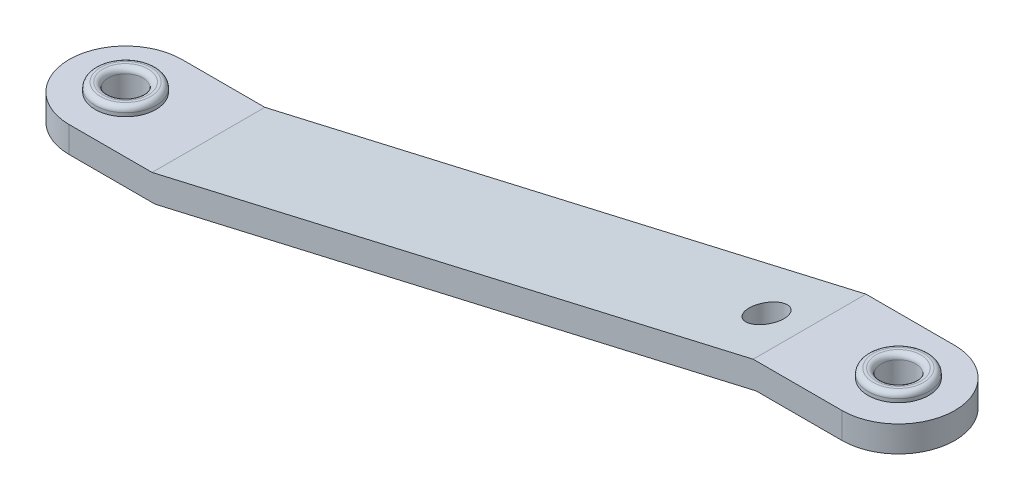
ISO-10303-21;
HEADER;
FILE_DESCRIPTION(('STEP AP214'),'2;1');
FILE_NAME('part.step','',(''),(''),'','','');
FILE_SCHEMA(('AUTOMOTIVE_DESIGN { 1 0 10303 214 1 1 1 1 }'));
ENDSEC;
DATA;
#1=APPLICATION_CONTEXT('core data for automotive mechanical design processes');
#2=APPLICATION_PROTOCOL_DEFINITION('international standard','automotive_design',2000,#1);
#3=PRODUCT_CONTEXT('',#1,'mechanical');
#4=PRODUCT('Part','Part','',(#3));
#5=PRODUCT_RELATED_PRODUCT_CATEGORY('part','',(#4));
#6=PRODUCT_DEFINITION_FORMATION('','',#4);
#7=PRODUCT_DEFINITION_CONTEXT('part definition',#1,'design');
#8=PRODUCT_DEFINITION('design','',#6,#7);
#9=PRODUCT_DEFINITION_SHAPE('','',#8);
#10=(LENGTH_UNIT() NAMED_UNIT(*) SI_UNIT(.MILLI.,.METRE.));
#11=(NAMED_UNIT(*) PLANE_ANGLE_UNIT() SI_UNIT($,.RADIAN.));
#12=(NAMED_UNIT(*) SI_UNIT($,.STERADIAN.) SOLID_ANGLE_UNIT());
#13=UNCERTAINTY_MEASURE_WITH_UNIT(LENGTH_MEASURE(1.E-05),#10,'distance_accuracy_value','');
#14=(GEOMETRIC_REPRESENTATION_CONTEXT(3) GLOBAL_UNCERTAINTY_ASSIGNED_CONTEXT((#13)) GLOBAL_UNIT_ASSIGNED_CONTEXT((#10,
#11,#12)) REPRESENTATION_CONTEXT('',''));
#15=CARTESIAN_POINT('',(0.,0.,0.));
#16=DIRECTION('',(0.,0.,1.));
#17=DIRECTION('',(1.,0.,0.));
#18=AXIS2_PLACEMENT_3D('',#15,#16,#17);
#19=CARTESIAN_POINT('',(-74.25,0.,0.));
#20=DIRECTION('',(0.,-1.,0.));
#21=DIRECTION('',(0.,0.,-1.));
#22=AXIS2_PLACEMENT_3D('',#19,#20,#21);
#23=CYLINDRICAL_SURFACE('',#22,48.75);
#24=DIRECTION('',(0.,-1.,0.));
#25=VECTOR('',#24,1.);
#26=CARTESIAN_POINT('',(-74.25,120.,-48.75));
#27=LINE('',#26,#25);
#28=CARTESIAN_POINT('',(-74.25,0.,-48.75));
#29=VERTEX_POINT('',#28);
#30=CARTESIAN_POINT('',(-74.25,22.5,-48.75));
#31=VERTEX_POINT('',#30);
#32=EDGE_CURVE('E167',#29,#31,#27,.F.);
#33=ORIENTED_EDGE('',*,*,#32,.F.);
#34=CARTESIAN_POINT('',(-74.25,0.,0.));
#35=DIRECTION('',(0.,-1.,0.));
#36=DIRECTION('',(0.,0.,-1.));
#37=AXIS2_PLACEMENT_3D('',#34,#35,#36);
#38=CIRCLE('',#37,48.75);
#39=CARTESIAN_POINT('',(-74.25,0.,48.75));
#40=VERTEX_POINT('',#39);
#41=EDGE_CURVE('E55',#40,#29,#38,.T.);
#42=ORIENTED_EDGE('',*,*,#41,.F.);
#43=DIRECTION('',(0.,1.,0.));
#44=VECTOR('',#43,1.);
#45=CARTESIAN_POINT('',(-74.25,0.,48.75));
#46=LINE('',#45,#44);
#47=CARTESIAN_POINT('',(-74.25,22.5,48.75));
#48=VERTEX_POINT('',#47);
#49=EDGE_CURVE('E169',#48,#40,#46,.F.);
#50=ORIENTED_EDGE('',*,*,#49,.F.);
#51=CARTESIAN_POINT('',(-74.25,22.5,0.));
#52=DIRECTION('',(0.,-1.,0.));
#53=DIRECTION('',(0.,0.,-1.));
#54=AXIS2_PLACEMENT_3D('',#51,#52,#53);
#55=CIRCLE('',#54,48.75);
#56=EDGE_CURVE('E63',#31,#48,#55,.F.);
#57=ORIENTED_EDGE('',*,*,#56,.F.);
#58=EDGE_LOOP('',(#33,#42,#50,#57));
#59=FACE_BOUND('',#58,.T.);
#60=ADVANCED_FACE('F40',(#59),#23,.T.);
#61=CARTESIAN_POINT('',(594.027104914098,120.,0.));
#62=DIRECTION('',(0.,-1.,0.));
#63=DIRECTION('',(0.,0.,-1.));
#64=AXIS2_PLACEMENT_3D('',#61,#62,#63);
#65=CYLINDRICAL_SURFACE('',#64,48.75);
#66=DIRECTION('',(0.,1.,0.));
#67=VECTOR('',#66,1.);
#68=CARTESIAN_POINT('',(594.027104914098,0.,48.75));
#69=LINE('',#68,#67);
#70=CARTESIAN_POINT('',(594.027104914098,120.,48.75));
#71=VERTEX_POINT('',#70);
#72=CARTESIAN_POINT('',(594.027104914098,142.5,48.75));
#73=VERTEX_POINT('',#72);
#74=EDGE_CURVE('E113',#71,#73,#69,.T.);
#75=ORIENTED_EDGE('',*,*,#74,.F.);
#76=CARTESIAN_POINT('',(594.027104914098,120.,0.));
#77=DIRECTION('',(0.,-1.,0.));
#78=DIRECTION('',(0.,0.,-1.));
#79=AXIS2_PLACEMENT_3D('',#76,#77,#78);
#80=CIRCLE('',#79,48.75);
#81=CARTESIAN_POINT('',(594.027104914098,120.,-48.75));
#82=VERTEX_POINT('',#81);
#83=EDGE_CURVE('E163',#82,#71,#80,.T.);
#84=ORIENTED_EDGE('',*,*,#83,.F.);
#85=DIRECTION('',(0.,-1.,0.));
#86=VECTOR('',#85,1.);
#87=CARTESIAN_POINT('',(594.027104914098,120.,-48.75));
#88=LINE('',#87,#86);
#89=CARTESIAN_POINT('',(594.027104914098,142.5,-48.75));
#90=VERTEX_POINT('',#89);
#91=EDGE_CURVE('E161',#90,#82,#88,.T.);
#92=ORIENTED_EDGE('',*,*,#91,.F.);
#93=CARTESIAN_POINT('',(594.027104914098,142.5,0.));
#94=DIRECTION('',(0.,-1.,0.));
#95=DIRECTION('',(0.,0.,-1.));
#96=AXIS2_PLACEMENT_3D('',#93,#94,#95);
#97=CIRCLE('',#96,48.75);
#98=EDGE_CURVE('E165',#73,#90,#97,.F.);
#99=ORIENTED_EDGE('',*,*,#98,.F.);
#100=EDGE_LOOP('',(#75,#84,#92,#99));
#101=FACE_BOUND('',#100,.T.);
#102=ADVANCED_FACE('F245',(#101),#65,.T.);
#103=CARTESIAN_POINT('',(519.777104914098,120.,-48.75));
#104=DIRECTION('',(0.,0.,-1.));
#105=DIRECTION('',(1.,0.,0.));
#106=AXIS2_PLACEMENT_3D('',#103,#104,#105);
#107=PLANE('',#106);
#108=DIRECTION('',(1.,0.,0.));
#109=VECTOR('',#108,1.);
#110=CARTESIAN_POINT('',(-123.,0.,-48.75));
#111=LINE('',#110,#109);
#112=CARTESIAN_POINT('',(0.,0.,-48.75));
#113=VERTEX_POINT('',#112);
#114=EDGE_CURVE('E105',#29,#113,#111,.T.);
#115=ORIENTED_EDGE('',*,*,#114,.F.);
#116=ORIENTED_EDGE('',*,*,#32,.T.);
#117=DIRECTION('',(1.,0.,0.));
#118=VECTOR('',#117,1.);
#119=CARTESIAN_POINT('',(-123.,22.5,-48.75));
#120=LINE('',#119,#118);
#121=CARTESIAN_POINT('',(-2.56355118678701,22.5,-48.75));
#122=VERTEX_POINT('',#121);
#123=EDGE_CURVE('E147',#31,#122,#120,.T.);
#124=ORIENTED_EDGE('',*,*,#123,.T.);
#125=DIRECTION('',(0.974370064785235,0.224951054343865,0.));
#126=VECTOR('',#125,1.);
#127=CARTESIAN_POINT('',(-5.06139872273697,21.9233264576678,-48.75));
#128=LINE('',#127,#126);
#129=CARTESIAN_POINT('',(517.213553727311,142.5,-48.75));
#130=VERTEX_POINT('',#129);
#131=EDGE_CURVE('E139',#122,#130,#128,.T.);
#132=ORIENTED_EDGE('',*,*,#131,.T.);
#133=DIRECTION('',(1.,0.,0.));
#134=VECTOR('',#133,1.);
#135=CARTESIAN_POINT('',(519.777104914098,142.5,-48.75));
#136=LINE('',#135,#134);
#137=EDGE_CURVE('E143',#130,#90,#136,.T.);
#138=ORIENTED_EDGE('',*,*,#137,.T.);
#139=ORIENTED_EDGE('',*,*,#91,.T.);
#140=DIRECTION('',(1.,0.,0.));
#141=VECTOR('',#140,1.);
#142=CARTESIAN_POINT('',(519.777104914098,120.,-48.75));
#143=LINE('',#142,#141);
#144=CARTESIAN_POINT('',(519.777104914098,120.,-48.75));
#145=VERTEX_POINT('',#144);
#146=EDGE_CURVE('E121',#145,#82,#143,.T.);
#147=ORIENTED_EDGE('',*,*,#146,.F.);
#148=DIRECTION('',(0.974370064785235,0.224951054343865,0.));
#149=VECTOR('',#148,1.);
#150=CARTESIAN_POINT('',(0.,0.,-48.75));
#151=LINE('',#150,#149);
#152=EDGE_CURVE('E117',#113,#145,#151,.T.);
#153=ORIENTED_EDGE('',*,*,#152,.F.);
#154=EDGE_LOOP('',(#115,#116,#124,#132,#138,#139,#147,#153));
#155=FACE_BOUND('',#154,.T.);
#156=ADVANCED_FACE('F118',(#155),#107,.T.);
#157=CARTESIAN_POINT('',(-123.,0.,48.75));
#158=DIRECTION('',(0.,0.,-1.));
#159=DIRECTION('',(1.,0.,0.));
#160=AXIS2_PLACEMENT_3D('',#157,#158,#159);
#161=PLANE('',#160);
#162=DIRECTION('',(1.,0.,0.));
#163=VECTOR('',#162,1.);
#164=CARTESIAN_POINT('',(-123.,22.5,48.75));
#165=LINE('',#164,#163);
#166=CARTESIAN_POINT('',(-2.56355118678701,22.5,48.75));
#167=VERTEX_POINT('',#166);
#168=EDGE_CURVE('E145',#48,#167,#165,.T.);
#169=ORIENTED_EDGE('',*,*,#168,.F.);
#170=ORIENTED_EDGE('',*,*,#49,.T.);
#171=DIRECTION('',(1.,0.,0.));
#172=VECTOR('',#171,1.);
#173=CARTESIAN_POINT('',(-123.,0.,48.75));
#174=LINE('',#173,#172);
#175=CARTESIAN_POINT('',(0.,0.,48.75));
#176=VERTEX_POINT('',#175);
#177=EDGE_CURVE('E114',#40,#176,#174,.T.);
#178=ORIENTED_EDGE('',*,*,#177,.T.);
#179=DIRECTION('',(0.974370064785235,0.224951054343865,0.));
#180=VECTOR('',#179,1.);
#181=CARTESIAN_POINT('',(0.,0.,48.75));
#182=LINE('',#181,#180);
#183=CARTESIAN_POINT('',(519.777104914098,120.,48.75));
#184=VERTEX_POINT('',#183);
#185=EDGE_CURVE('E129',#176,#184,#182,.T.);
#186=ORIENTED_EDGE('',*,*,#185,.T.);
#187=DIRECTION('',(1.,0.,0.));
#188=VECTOR('',#187,1.);
#189=CARTESIAN_POINT('',(519.777104914098,120.,48.75));
#190=LINE('',#189,#188);
#191=EDGE_CURVE('E158',#184,#71,#190,.T.);
#192=ORIENTED_EDGE('',*,*,#191,.T.);
#193=ORIENTED_EDGE('',*,*,#74,.T.);
#194=DIRECTION('',(1.,0.,0.));
#195=VECTOR('',#194,1.);
#196=CARTESIAN_POINT('',(519.777104914098,142.5,48.75));
#197=LINE('',#196,#195);
#198=CARTESIAN_POINT('',(517.213553727311,142.5,48.75));
#199=VERTEX_POINT('',#198);
#200=EDGE_CURVE('E144',#199,#73,#197,.T.);
#201=ORIENTED_EDGE('',*,*,#200,.F.);
#202=DIRECTION('',(0.974370064785235,0.224951054343865,0.));
#203=VECTOR('',#202,1.);
#204=CARTESIAN_POINT('',(-5.06139872273697,21.9233264576678,48.75));
#205=LINE('',#204,#203);
#206=EDGE_CURVE('E140',#167,#199,#205,.T.);
#207=ORIENTED_EDGE('',*,*,#206,.F.);
#208=EDGE_LOOP('',(#169,#170,#178,#186,#192,#193,#201,#207));
#209=FACE_BOUND('',#208,.T.);
#210=ADVANCED_FACE('F305',(#209),#161,.F.);
#211=CARTESIAN_POINT('',(-123.,0.,-48.75));
#212=DIRECTION('',(0.,-1.,0.));
#213=DIRECTION('',(0.,0.,-1.));
#214=AXIS2_PLACEMENT_3D('',#211,#212,#213);
#215=PLANE('',#214);
#216=CARTESIAN_POINT('',(-74.25,0.,0.));
#217=DIRECTION('',(0.,-1.,0.));
#218=DIRECTION('',(0.,0.,-1.));
#219=AXIS2_PLACEMENT_3D('',#216,#217,#218);
#220=CIRCLE('',#219,26.25);
#221=CARTESIAN_POINT('',(-74.25,0.,-26.25));
#222=VERTEX_POINT('',#221);
#223=EDGE_CURVE('E173',#222,#222,#220,.T.);
#224=ORIENTED_EDGE('',*,*,#223,.F.);
#225=EDGE_LOOP('',(#224));
#226=FACE_BOUND('',#225,.T.);
#227=ORIENTED_EDGE('',*,*,#177,.F.);
#228=ORIENTED_EDGE('',*,*,#41,.T.);
#229=ORIENTED_EDGE('',*,*,#114,.T.);
#230=DIRECTION('',(0.,0.,1.));
#231=VECTOR('',#230,1.);
#232=CARTESIAN_POINT('',(0.,0.,-48.75));
#233=LINE('',#232,#231);
#234=EDGE_CURVE('E110',#113,#176,#233,.T.);
#235=ORIENTED_EDGE('',*,*,#234,.T.);
#236=EDGE_LOOP('',(#227,#228,#229,#235));
#237=FACE_BOUND('',#236,.T.);
#238=ADVANCED_FACE('F108',(#226,#237),#215,.T.);
#239=CARTESIAN_POINT('',(0.,0.,-48.75));
#240=DIRECTION('',(0.224951054343865,-0.974370064785235,0.));
#241=DIRECTION('',(0.974370064785235,0.224951054343865,0.));
#242=AXIS2_PLACEMENT_3D('',#239,#240,#241);
#243=PLANE('',#242);
#244=CARTESIAN_POINT('',(480.,110.81673174027,0.));
#245=DIRECTION('',(0.224951054343865,-0.974370064785235,0.));
#246=DIRECTION('',(0.974370064785235,0.224951054343865,0.));
#247=AXIS2_PLACEMENT_3D('',#244,#245,#246);
#248=ELLIPSE('',#247,15.3945616169009,15.);
#249=CARTESIAN_POINT('',(495.,114.279754607154,0.));
#250=VERTEX_POINT('',#249);
#251=EDGE_CURVE('E152',#250,#250,#248,.T.);
#252=ORIENTED_EDGE('',*,*,#251,.F.);
#253=EDGE_LOOP('',(#252));
#254=FACE_BOUND('',#253,.T.);
#255=ORIENTED_EDGE('',*,*,#185,.F.);
#256=ORIENTED_EDGE('',*,*,#234,.F.);
#257=ORIENTED_EDGE('',*,*,#152,.T.);
#258=DIRECTION('',(0.,0.,1.));
#259=VECTOR('',#258,1.);
#260=CARTESIAN_POINT('',(519.777104914098,120.,-48.75));
#261=LINE('',#260,#259);
#262=EDGE_CURVE('E134',#145,#184,#261,.T.);
#263=ORIENTED_EDGE('',*,*,#262,.T.);
#264=EDGE_LOOP('',(#255,#256,#257,#263));
#265=FACE_BOUND('',#264,.T.);
#266=ADVANCED_FACE('F127',(#254,#265),#243,.T.);
#267=CARTESIAN_POINT('',(519.777104914098,120.,-48.75));
#268=DIRECTION('',(0.,-1.,0.));
#269=DIRECTION('',(0.,0.,-1.));
#270=AXIS2_PLACEMENT_3D('',#267,#268,#269);
#271=PLANE('',#270);
#272=CARTESIAN_POINT('',(594.027104914098,120.,0.));
#273=DIRECTION('',(0.,-1.,0.));
#274=DIRECTION('',(0.,0.,-1.));
#275=AXIS2_PLACEMENT_3D('',#272,#273,#274);
#276=CIRCLE('',#275,26.2500000000001);
#277=CARTESIAN_POINT('',(594.027104914098,120.,-26.2500000000001));
#278=VERTEX_POINT('',#277);
#279=EDGE_CURVE('E187',#278,#278,#276,.T.);
#280=ORIENTED_EDGE('',*,*,#279,.F.);
#281=EDGE_LOOP('',(#280));
#282=FACE_BOUND('',#281,.T.);
#283=ORIENTED_EDGE('',*,*,#146,.T.);
#284=ORIENTED_EDGE('',*,*,#83,.T.);
#285=ORIENTED_EDGE('',*,*,#191,.F.);
#286=ORIENTED_EDGE('',*,*,#262,.F.);
#287=EDGE_LOOP('',(#283,#284,#285,#286));
#288=FACE_BOUND('',#287,.T.);
#289=ADVANCED_FACE('F302',(#282,#288),#271,.T.);
#290=CARTESIAN_POINT('',(-123.,22.5,-48.75));
#291=DIRECTION('',(0.,-1.,0.));
#292=DIRECTION('',(0.,0.,-1.));
#293=AXIS2_PLACEMENT_3D('',#290,#291,#292);
#294=PLANE('',#293);
#295=CARTESIAN_POINT('',(-74.25,22.5,0.));
#296=DIRECTION('',(0.,-1.,0.));
#297=DIRECTION('',(0.,0.,-1.));
#298=AXIS2_PLACEMENT_3D('',#295,#296,#297);
#299=CIRCLE('',#298,26.25);
#300=CARTESIAN_POINT('',(-74.25,22.5,-26.25));
#301=VERTEX_POINT('',#300);
#302=EDGE_CURVE('E177',#301,#301,#299,.T.);
#303=ORIENTED_EDGE('',*,*,#302,.T.);
#304=EDGE_LOOP('',(#303));
#305=FACE_BOUND('',#304,.T.);
#306=ORIENTED_EDGE('',*,*,#123,.F.);
#307=ORIENTED_EDGE('',*,*,#56,.T.);
#308=ORIENTED_EDGE('',*,*,#168,.T.);
#309=DIRECTION('',(0.,0.,1.));
#310=VECTOR('',#309,1.);
#311=CARTESIAN_POINT('',(-2.56355118678701,22.5,-48.75));
#312=LINE('',#311,#310);
#313=EDGE_CURVE('E136',#122,#167,#312,.T.);
#314=ORIENTED_EDGE('',*,*,#313,.F.);
#315=EDGE_LOOP('',(#306,#307,#308,#314));
#316=FACE_BOUND('',#315,.T.);
#317=ADVANCED_FACE('F308',(#305,#316),#294,.F.);
#318=CARTESIAN_POINT('',(-5.06139872273697,21.9233264576678,-48.75));
#319=DIRECTION('',(0.224951054343865,-0.974370064785235,0.));
#320=DIRECTION('',(0.974370064785235,0.224951054343865,0.));
#321=AXIS2_PLACEMENT_3D('',#318,#319,#320);
#322=PLANE('',#321);
#323=CARTESIAN_POINT('',(480.,133.908574165622,0.));
#324=DIRECTION('',(0.224951054343865,-0.974370064785235,0.));
#325=DIRECTION('',(0.974370064785235,0.224951054343865,0.));
#326=AXIS2_PLACEMENT_3D('',#323,#324,#325);
#327=ELLIPSE('',#326,15.3945616169009,15.);
#328=CARTESIAN_POINT('',(495.,137.371597032505,0.));
#329=VERTEX_POINT('',#328);
#330=EDGE_CURVE('E174',#329,#329,#327,.T.);
#331=ORIENTED_EDGE('',*,*,#330,.T.);
#332=EDGE_LOOP('',(#331));
#333=FACE_BOUND('',#332,.T.);
#334=ORIENTED_EDGE('',*,*,#206,.T.);
#335=DIRECTION('',(0.,0.,1.));
#336=VECTOR('',#335,1.);
#337=CARTESIAN_POINT('',(517.213553727311,142.5,-48.75));
#338=LINE('',#337,#336);
#339=EDGE_CURVE('E141',#130,#199,#338,.T.);
#340=ORIENTED_EDGE('',*,*,#339,.F.);
#341=ORIENTED_EDGE('',*,*,#131,.F.);
#342=ORIENTED_EDGE('',*,*,#313,.T.);
#343=EDGE_LOOP('',(#334,#340,#341,#342));
#344=FACE_BOUND('',#343,.T.);
#345=ADVANCED_FACE('F311',(#333,#344),#322,.F.);
#346=CARTESIAN_POINT('',(519.777104914098,142.5,-48.75));
#347=DIRECTION('',(0.,-1.,0.));
#348=DIRECTION('',(0.,0.,-1.));
#349=AXIS2_PLACEMENT_3D('',#346,#347,#348);
#350=PLANE('',#349);
#351=CARTESIAN_POINT('',(594.027104914098,142.5,0.));
#352=DIRECTION('',(0.,-1.,0.));
#353=DIRECTION('',(0.,0.,-1.));
#354=AXIS2_PLACEMENT_3D('',#351,#352,#353);
#355=CIRCLE('',#354,26.2500000000001);
#356=CARTESIAN_POINT('',(594.027104914098,142.5,-26.2500000000001));
#357=VERTEX_POINT('',#356);
#358=EDGE_CURVE('E180',#357,#357,#355,.T.);
#359=ORIENTED_EDGE('',*,*,#358,.T.);
#360=EDGE_LOOP('',(#359));
#361=FACE_BOUND('',#360,.T.);
#362=ORIENTED_EDGE('',*,*,#200,.T.);
#363=ORIENTED_EDGE('',*,*,#98,.T.);
#364=ORIENTED_EDGE('',*,*,#137,.F.);
#365=ORIENTED_EDGE('',*,*,#339,.T.);
#366=EDGE_LOOP('',(#362,#363,#364,#365));
#367=FACE_BOUND('',#366,.T.);
#368=ADVANCED_FACE('F315',(#361,#367),#350,.F.);
#369=CARTESIAN_POINT('',(480.,0.,0.));
#370=DIRECTION('',(0.,1.,0.));
#371=DIRECTION('',(0.,0.,1.));
#372=AXIS2_PLACEMENT_3D('',#369,#370,#371);
#373=CYLINDRICAL_SURFACE('',#372,15.);
#374=ORIENTED_EDGE('',*,*,#251,.T.);
#375=EDGE_LOOP('',(#374));
#376=FACE_BOUND('',#375,.T.);
#377=ORIENTED_EDGE('',*,*,#330,.F.);
#378=EDGE_LOOP('',(#377));
#379=FACE_BOUND('',#378,.T.);
#380=ADVANCED_FACE('F318',(#376,#379),#373,.F.);
#381=CARTESIAN_POINT('',(0.,30.,0.));
#382=DIRECTION('',(0.,1.,0.));
#383=DIRECTION('',(0.,0.,1.));
#384=AXIS2_PLACEMENT_3D('',#381,#382,#383);
#385=PLANE('',#384);
#386=CARTESIAN_POINT('',(-74.25,30.,0.));
#387=DIRECTION('',(0.,1.,0.));
#388=DIRECTION('',(0.,0.,1.));
#389=AXIS2_PLACEMENT_3D('',#386,#387,#388);
#390=CIRCLE('',#389,21.75);
#391=CARTESIAN_POINT('',(-74.25,30.,21.75));
#392=VERTEX_POINT('',#391);
#393=EDGE_CURVE('E202',#392,#392,#390,.T.);
#394=ORIENTED_EDGE('',*,*,#393,.T.);
#395=EDGE_LOOP('',(#394));
#396=FACE_BOUND('',#395,.T.);
#397=CARTESIAN_POINT('',(-74.25,30.,0.));
#398=DIRECTION('',(0.,1.,0.));
#399=DIRECTION('',(0.,0.,1.));
#400=AXIS2_PLACEMENT_3D('',#397,#398,#399);
#401=CIRCLE('',#400,19.5);
#402=CARTESIAN_POINT('',(-74.25,30.,19.5));
#403=VERTEX_POINT('',#402);
#404=EDGE_CURVE('E199',#403,#403,#401,.F.);
#405=ORIENTED_EDGE('',*,*,#404,.T.);
#406=EDGE_LOOP('',(#405));
#407=FACE_BOUND('',#406,.T.);
#408=ADVANCED_FACE('F325',(#396,#407),#385,.T.);
#409=CARTESIAN_POINT('',(-74.25,-7.5,0.));
#410=DIRECTION('',(0.,1.,0.));
#411=DIRECTION('',(0.,0.,1.));
#412=AXIS2_PLACEMENT_3D('',#409,#410,#411);
#413=CYLINDRICAL_SURFACE('',#412,26.25);
#414=CARTESIAN_POINT('',(-74.25,25.5,0.));
#415=DIRECTION('',(0.,1.,0.));
#416=DIRECTION('',(0.,0.,1.));
#417=AXIS2_PLACEMENT_3D('',#414,#415,#416);
#418=CIRCLE('',#417,26.25);
#419=CARTESIAN_POINT('',(-74.25,25.5,26.25));
#420=VERTEX_POINT('',#419);
#421=EDGE_CURVE('E205',#420,#420,#418,.F.);
#422=ORIENTED_EDGE('',*,*,#421,.T.);
#423=EDGE_LOOP('',(#422));
#424=FACE_BOUND('',#423,.T.);
#425=ORIENTED_EDGE('',*,*,#302,.F.);
#426=EDGE_LOOP('',(#425));
#427=FACE_BOUND('',#426,.T.);
#428=ADVANCED_FACE('F389',(#424,#427),#413,.T.);
#429=CARTESIAN_POINT('',(-74.25,0.,0.));
#430=DIRECTION('',(0.,1.,0.));
#431=DIRECTION('',(0.,0.,1.));
#432=AXIS2_PLACEMENT_3D('',#429,#430,#431);
#433=CYLINDRICAL_SURFACE('',#432,15.);
#434=CARTESIAN_POINT('',(-74.25,-3.,0.));
#435=DIRECTION('',(0.,1.,0.));
#436=DIRECTION('',(0.,0.,1.));
#437=AXIS2_PLACEMENT_3D('',#434,#435,#436);
#438=CIRCLE('',#437,15.);
#439=CARTESIAN_POINT('',(-74.25,-3.,15.));
#440=VERTEX_POINT('',#439);
#441=EDGE_CURVE('E196',#440,#440,#438,.F.);
#442=CARTESIAN_POINT('',(-74.25,25.5,0.));
#443=DIRECTION('',(0.,1.,0.));
#444=DIRECTION('',(0.,0.,1.));
#445=AXIS2_PLACEMENT_3D('',#442,#443,#444);
#446=CIRCLE('',#445,15.);
#447=CARTESIAN_POINT('',(-74.25,25.5,15.));
#448=VERTEX_POINT('',#447);
#449=EDGE_CURVE('E193',#448,#448,#446,.T.);
#450=CARTESIAN_POINT('',(-74.25,-3.,15.));
#451=CARTESIAN_POINT('',(-74.25,-2.703125,15.));
#452=CARTESIAN_POINT('',(-74.25,-2.40625,15.));
#453=CARTESIAN_POINT('',(-74.25,-1.8125,15.));
#454=CARTESIAN_POINT('',(-74.25,-1.515625,15.));
#455=CARTESIAN_POINT('',(-74.25,-0.921875,15.));
#456=CARTESIAN_POINT('',(-74.25,-0.625,15.));
#457=CARTESIAN_POINT('',(-74.25,-0.0312500000000004,15.));
#458=CARTESIAN_POINT('',(-74.25,0.265625,15.));
#459=CARTESIAN_POINT('',(-74.25,0.859374999999999,15.));
#460=CARTESIAN_POINT('',(-74.25,1.15625,15.));
#461=CARTESIAN_POINT('',(-74.25,1.75,15.));
#462=CARTESIAN_POINT('',(-74.25,2.046875,15.));
#463=CARTESIAN_POINT('',(-74.25,2.640625,15.));
#464=CARTESIAN_POINT('',(-74.25,2.9375,15.));
#465=CARTESIAN_POINT('',(-74.25,3.53125,15.));
#466=CARTESIAN_POINT('',(-74.25,3.828125,15.));
#467=CARTESIAN_POINT('',(-74.25,4.421875,15.));
#468=CARTESIAN_POINT('',(-74.25,4.71875,15.));
#469=CARTESIAN_POINT('',(-74.25,5.3125,15.));
#470=CARTESIAN_POINT('',(-74.25,5.609375,15.));
#471=CARTESIAN_POINT('',(-74.25,6.203125,15.));
#472=CARTESIAN_POINT('',(-74.25,6.5,15.));
#473=CARTESIAN_POINT('',(-74.25,7.09375,15.));
#474=CARTESIAN_POINT('',(-74.25,7.390625,15.));
#475=CARTESIAN_POINT('',(-74.25,7.984375,15.));
#476=CARTESIAN_POINT('',(-74.25,8.28125,15.));
#477=CARTESIAN_POINT('',(-74.25,8.875,15.));
#478=CARTESIAN_POINT('',(-74.25,9.171875,15.));
#479=CARTESIAN_POINT('',(-74.25,9.765625,15.));
#480=CARTESIAN_POINT('',(-74.25,10.0625,15.));
#481=CARTESIAN_POINT('',(-74.25,10.65625,15.));
#482=CARTESIAN_POINT('',(-74.25,10.953125,15.));
#483=CARTESIAN_POINT('',(-74.25,11.546875,15.));
#484=CARTESIAN_POINT('',(-74.25,11.84375,15.));
#485=CARTESIAN_POINT('',(-74.25,12.4375,15.));
#486=CARTESIAN_POINT('',(-74.25,12.734375,15.));
#487=CARTESIAN_POINT('',(-74.25,13.328125,15.));
#488=CARTESIAN_POINT('',(-74.25,13.625,15.));
#489=CARTESIAN_POINT('',(-74.25,14.21875,15.));
#490=CARTESIAN_POINT('',(-74.25,14.515625,15.));
#491=CARTESIAN_POINT('',(-74.25,15.109375,15.));
#492=CARTESIAN_POINT('',(-74.25,15.40625,15.));
#493=CARTESIAN_POINT('',(-74.25,16.,15.));
#494=CARTESIAN_POINT('',(-74.25,16.296875,15.));
#495=CARTESIAN_POINT('',(-74.25,16.890625,15.));
#496=CARTESIAN_POINT('',(-74.25,17.1875,15.));
#497=CARTESIAN_POINT('',(-74.25,17.78125,15.));
#498=CARTESIAN_POINT('',(-74.25,18.078125,15.));
#499=CARTESIAN_POINT('',(-74.25,18.671875,15.));
#500=CARTESIAN_POINT('',(-74.25,18.96875,15.));
#501=CARTESIAN_POINT('',(-74.25,19.5625,15.));
#502=CARTESIAN_POINT('',(-74.25,19.859375,15.));
#503=CARTESIAN_POINT('',(-74.25,20.453125,15.));
#504=CARTESIAN_POINT('',(-74.25,20.75,15.));
#505=CARTESIAN_POINT('',(-74.25,21.34375,15.));
#506=CARTESIAN_POINT('',(-74.25,21.640625,15.));
#507=CARTESIAN_POINT('',(-74.25,22.234375,15.));
#508=CARTESIAN_POINT('',(-74.25,22.53125,15.));
#509=CARTESIAN_POINT('',(-74.25,23.125,15.));
#510=CARTESIAN_POINT('',(-74.25,23.421875,15.));
#511=CARTESIAN_POINT('',(-74.25,24.015625,15.));
#512=CARTESIAN_POINT('',(-74.25,24.3125,15.));
#513=CARTESIAN_POINT('',(-74.25,24.90625,15.));
#514=CARTESIAN_POINT('',(-74.25,25.203125,15.));
#515=CARTESIAN_POINT('',(-74.25,25.5,15.));
#516=B_SPLINE_CURVE_WITH_KNOTS('',3,(#450,#451,#452,#453,#454,#455,#456,#457,#458,#459,#460,
#461,#462,#463,#464,#465,#466,#467,#468,#469,#470,#471,#472,#473,#474,#475,#476,#477,#478,#479,
#480,#481,#482,#483,#484,#485,#486,#487,#488,#489,#490,#491,#492,#493,#494,#495,#496,#497,#498,
#499,#500,#501,#502,#503,#504,#505,#506,#507,#508,#509,#510,#511,#512,#513,#514,#515),
.UNSPECIFIED.,.F.,.F.,(4,2,2,2,2,2,2,2,2,2,2,2,2,2,2,2,2,2,2,2,2,2,2,2,2,2,2,2,2,2,2,2,4),(0.,
0.890625,1.78125,2.671875,3.5625,4.453125,5.34375,6.234375,7.125,8.015625,8.90625,9.796875,
10.6875,11.578125,12.46875,13.359375,14.25,15.140625,16.03125,16.921875,17.8125,18.703125,
19.59375,20.484375,21.375,22.265625,23.15625,24.046875,24.9375,25.828125,26.71875,27.609375,
28.5),.UNSPECIFIED.);
#517=EDGE_CURVE('BSEAM396',#440,#448,#516,.T.);
#518=ORIENTED_EDGE('',*,*,#441,.T.);
#519=ORIENTED_EDGE('',*,*,#449,.T.);
#520=ORIENTED_EDGE('',*,*,#517,.T.);
#521=ORIENTED_EDGE('',*,*,#517,.F.);
#522=EDGE_LOOP('',(#518,#520,#519,#521));
#523=FACE_BOUND('',#522,.T.);
#524=ADVANCED_FACE('F396',(#523),#433,.F.);
#525=CARTESIAN_POINT('',(-74.25,-3.,0.));
#526=DIRECTION('',(0.,1.,0.));
#527=DIRECTION('',(0.,0.,1.));
#528=AXIS2_PLACEMENT_3D('',#525,#526,#527);
#529=CIRCLE('',#528,26.25);
#530=CARTESIAN_POINT('',(-74.25,-3.,26.25));
#531=VERTEX_POINT('',#530);
#532=EDGE_CURVE('E183',#531,#531,#529,.T.);
#533=ORIENTED_EDGE('',*,*,#532,.T.);
#534=EDGE_LOOP('',(#533));
#535=FACE_BOUND('',#534,.T.);
#536=ORIENTED_EDGE('',*,*,#223,.T.);
#537=EDGE_LOOP('',(#536));
#538=FACE_BOUND('',#537,.T.);
#539=ADVANCED_FACE('F399',(#535,#538),#413,.T.);
#540=CARTESIAN_POINT('',(0.,-7.5,0.));
#541=DIRECTION('',(0.,1.,0.));
#542=DIRECTION('',(0.,0.,1.));
#543=AXIS2_PLACEMENT_3D('',#540,#541,#542);
#544=PLANE('',#543);
#545=CARTESIAN_POINT('',(-74.25,-7.5,0.));
#546=DIRECTION('',(0.,1.,0.));
#547=DIRECTION('',(0.,0.,1.));
#548=AXIS2_PLACEMENT_3D('',#545,#546,#547);
#549=CIRCLE('',#548,21.75);
#550=CARTESIAN_POINT('',(-74.25,-7.5,21.75));
#551=VERTEX_POINT('',#550);
#552=EDGE_CURVE('E190',#551,#551,#549,.F.);
#553=ORIENTED_EDGE('',*,*,#552,.T.);
#554=EDGE_LOOP('',(#553));
#555=FACE_BOUND('',#554,.T.);
#556=CARTESIAN_POINT('',(-74.25,-7.5,0.));
#557=DIRECTION('',(0.,1.,0.));
#558=DIRECTION('',(0.,0.,1.));
#559=AXIS2_PLACEMENT_3D('',#556,#557,#558);
#560=CIRCLE('',#559,19.5);
#561=CARTESIAN_POINT('',(-74.25,-7.5,19.5));
#562=VERTEX_POINT('',#561);
#563=EDGE_CURVE('E186',#562,#562,#560,.T.);
#564=ORIENTED_EDGE('',*,*,#563,.T.);
#565=EDGE_LOOP('',(#564));
#566=FACE_BOUND('',#565,.T.);
#567=ADVANCED_FACE('F412',(#555,#566),#544,.F.);
#568=CARTESIAN_POINT('',(0.,150.,0.));
#569=DIRECTION('',(0.,1.,0.));
#570=DIRECTION('',(0.,0.,1.));
#571=AXIS2_PLACEMENT_3D('',#568,#569,#570);
#572=PLANE('',#571);
#573=CARTESIAN_POINT('',(594.027104914098,150.,0.));
#574=DIRECTION('',(0.,1.,0.));
#575=DIRECTION('',(0.,0.,1.));
#576=AXIS2_PLACEMENT_3D('',#573,#574,#575);
#577=CIRCLE('',#576,21.7500000000001);
#578=CARTESIAN_POINT('',(594.027104914098,150.,21.7500000000001));
#579=VERTEX_POINT('',#578);
#580=EDGE_CURVE('E48',#579,#579,#577,.T.);
#581=ORIENTED_EDGE('',*,*,#580,.T.);
#582=EDGE_LOOP('',(#581));
#583=FACE_BOUND('',#582,.T.);
#584=CARTESIAN_POINT('',(594.027104914098,150.,0.));
#585=DIRECTION('',(0.,1.,0.));
#586=DIRECTION('',(0.,0.,1.));
#587=AXIS2_PLACEMENT_3D('',#584,#585,#586);
#588=CIRCLE('',#587,19.4999999999999);
#589=CARTESIAN_POINT('',(594.027104914098,150.,19.4999999999999));
#590=VERTEX_POINT('',#589);
#591=EDGE_CURVE('E223',#590,#590,#588,.F.);
#592=ORIENTED_EDGE('',*,*,#591,.T.);
#593=EDGE_LOOP('',(#592));
#594=FACE_BOUND('',#593,.T.);
#595=ADVANCED_FACE('F228',(#583,#594),#572,.T.);
#596=CARTESIAN_POINT('',(594.027104914098,112.5,0.));
#597=DIRECTION('',(0.,1.,0.));
#598=DIRECTION('',(0.,0.,1.));
#599=AXIS2_PLACEMENT_3D('',#596,#597,#598);
#600=CYLINDRICAL_SURFACE('',#599,26.2500000000001);
#601=CARTESIAN_POINT('',(594.027104914098,145.5,0.));
#602=DIRECTION('',(0.,1.,0.));
#603=DIRECTION('',(0.,0.,1.));
#604=AXIS2_PLACEMENT_3D('',#601,#602,#603);
#605=CIRCLE('',#604,26.2500000000001);
#606=CARTESIAN_POINT('',(594.027104914098,145.5,26.2500000000001));
#607=VERTEX_POINT('',#606);
#608=EDGE_CURVE('E11',#607,#607,#605,.F.);
#609=ORIENTED_EDGE('',*,*,#608,.T.);
#610=EDGE_LOOP('',(#609));
#611=FACE_BOUND('',#610,.T.);
#612=ORIENTED_EDGE('',*,*,#358,.F.);
#613=EDGE_LOOP('',(#612));
#614=FACE_BOUND('',#613,.T.);
#615=ADVANCED_FACE('F288',(#611,#614),#600,.T.);
#616=CARTESIAN_POINT('',(594.027104914098,0.,0.));
#617=DIRECTION('',(0.,1.,0.));
#618=DIRECTION('',(0.,0.,1.));
#619=AXIS2_PLACEMENT_3D('',#616,#617,#618);
#620=CYLINDRICAL_SURFACE('',#619,14.9999999999999);
#621=CARTESIAN_POINT('',(594.027104914098,117.,0.));
#622=DIRECTION('',(0.,1.,0.));
#623=DIRECTION('',(0.,0.,1.));
#624=AXIS2_PLACEMENT_3D('',#621,#622,#623);
#625=CIRCLE('',#624,14.9999999999999);
#626=CARTESIAN_POINT('',(594.027104914098,117.,14.9999999999999));
#627=VERTEX_POINT('',#626);
#628=EDGE_CURVE('E220',#627,#627,#625,.F.);
#629=CARTESIAN_POINT('',(594.027104914098,145.5,0.));
#630=DIRECTION('',(0.,1.,0.));
#631=DIRECTION('',(0.,0.,1.));
#632=AXIS2_PLACEMENT_3D('',#629,#630,#631);
#633=CIRCLE('',#632,14.9999999999999);
#634=CARTESIAN_POINT('',(594.027104914098,145.5,14.9999999999999));
#635=VERTEX_POINT('',#634);
#636=EDGE_CURVE('E217',#635,#635,#633,.T.);
#637=CARTESIAN_POINT('',(594.027104914098,117.,14.9999999999999));
#638=CARTESIAN_POINT('',(594.027104914098,117.296875,14.9999999999999));
#639=CARTESIAN_POINT('',(594.027104914098,117.59375,14.9999999999999));
#640=CARTESIAN_POINT('',(594.027104914098,118.1875,14.9999999999999));
#641=CARTESIAN_POINT('',(594.027104914098,118.484375,14.9999999999999));
#642=CARTESIAN_POINT('',(594.027104914098,119.078125,14.9999999999999));
#643=CARTESIAN_POINT('',(594.027104914098,119.375,14.9999999999999));
#644=CARTESIAN_POINT('',(594.027104914098,119.96875,14.9999999999999));
#645=CARTESIAN_POINT('',(594.027104914098,120.265625,14.9999999999999));
#646=CARTESIAN_POINT('',(594.027104914098,120.859375,14.9999999999999));
#647=CARTESIAN_POINT('',(594.027104914098,121.15625,14.9999999999999));
#648=CARTESIAN_POINT('',(594.027104914098,121.75,14.9999999999999));
#649=CARTESIAN_POINT('',(594.027104914098,122.046875,14.9999999999999));
#650=CARTESIAN_POINT('',(594.027104914098,122.640625,14.9999999999999));
#651=CARTESIAN_POINT('',(594.027104914098,122.9375,14.9999999999999));
#652=CARTESIAN_POINT('',(594.027104914098,123.53125,14.9999999999999));
#653=CARTESIAN_POINT('',(594.027104914098,123.828125,14.9999999999999));
#654=CARTESIAN_POINT('',(594.027104914098,124.421875,14.9999999999999));
#655=CARTESIAN_POINT('',(594.027104914098,124.71875,14.9999999999999));
#656=CARTESIAN_POINT('',(594.027104914098,125.3125,14.9999999999999));
#657=CARTESIAN_POINT('',(594.027104914098,125.609375,14.9999999999999));
#658=CARTESIAN_POINT('',(594.027104914098,126.203125,14.9999999999999));
#659=CARTESIAN_POINT('',(594.027104914098,126.5,14.9999999999999));
#660=CARTESIAN_POINT('',(594.027104914098,127.09375,14.9999999999999));
#661=CARTESIAN_POINT('',(594.027104914098,127.390625,14.9999999999999));
#662=CARTESIAN_POINT('',(594.027104914098,127.984375,14.9999999999999));
#663=CARTESIAN_POINT('',(594.027104914098,128.28125,14.9999999999999));
#664=CARTESIAN_POINT('',(594.027104914098,128.875,14.9999999999999));
#665=CARTESIAN_POINT('',(594.027104914098,129.171875,14.9999999999999));
#666=CARTESIAN_POINT('',(594.027104914098,129.765625,14.9999999999999));
#667=CARTESIAN_POINT('',(594.027104914098,130.0625,14.9999999999999));
#668=CARTESIAN_POINT('',(594.027104914098,130.65625,14.9999999999999));
#669=CARTESIAN_POINT('',(594.027104914098,130.953125,14.9999999999999));
#670=CARTESIAN_POINT('',(594.027104914098,131.546875,14.9999999999999));
#671=CARTESIAN_POINT('',(594.027104914098,131.84375,14.9999999999999));
#672=CARTESIAN_POINT('',(594.027104914098,132.4375,14.9999999999999));
#673=CARTESIAN_POINT('',(594.027104914098,132.734375,14.9999999999999));
#674=CARTESIAN_POINT('',(594.027104914098,133.328125,14.9999999999999));
#675=CARTESIAN_POINT('',(594.027104914098,133.625,14.9999999999999));
#676=CARTESIAN_POINT('',(594.027104914098,134.21875,14.9999999999999));
#677=CARTESIAN_POINT('',(594.027104914098,134.515625,14.9999999999999));
#678=CARTESIAN_POINT('',(594.027104914098,135.109375,14.9999999999999));
#679=CARTESIAN_POINT('',(594.027104914098,135.40625,14.9999999999999));
#680=CARTESIAN_POINT('',(594.027104914098,136.,14.9999999999999));
#681=CARTESIAN_POINT('',(594.027104914098,136.296875,14.9999999999999));
#682=CARTESIAN_POINT('',(594.027104914098,136.890625,14.9999999999999));
#683=CARTESIAN_POINT('',(594.027104914098,137.1875,14.9999999999999));
#684=CARTESIAN_POINT('',(594.027104914098,137.78125,14.9999999999999));
#685=CARTESIAN_POINT('',(594.027104914098,138.078125,14.9999999999999));
#686=CARTESIAN_POINT('',(594.027104914098,138.671875,14.9999999999999));
#687=CARTESIAN_POINT('',(594.027104914098,138.96875,14.9999999999999));
#688=CARTESIAN_POINT('',(594.027104914098,139.5625,14.9999999999999));
#689=CARTESIAN_POINT('',(594.027104914098,139.859375,14.9999999999999));
#690=CARTESIAN_POINT('',(594.027104914098,140.453125,14.9999999999999));
#691=CARTESIAN_POINT('',(594.027104914098,140.75,14.9999999999999));
#692=CARTESIAN_POINT('',(594.027104914098,141.34375,14.9999999999999));
#693=CARTESIAN_POINT('',(594.027104914098,141.640625,14.9999999999999));
#694=CARTESIAN_POINT('',(594.027104914098,142.234375,14.9999999999999));
#695=CARTESIAN_POINT('',(594.027104914098,142.53125,14.9999999999999));
#696=CARTESIAN_POINT('',(594.027104914098,143.125,14.9999999999999));
#697=CARTESIAN_POINT('',(594.027104914098,143.421875,14.9999999999999));
#698=CARTESIAN_POINT('',(594.027104914098,144.015625,14.9999999999999));
#699=CARTESIAN_POINT('',(594.027104914098,144.3125,14.9999999999999));
#700=CARTESIAN_POINT('',(594.027104914098,144.90625,14.9999999999999));
#701=CARTESIAN_POINT('',(594.027104914098,145.203125,14.9999999999999));
#702=CARTESIAN_POINT('',(594.027104914098,145.5,14.9999999999999));
#703=B_SPLINE_CURVE_WITH_KNOTS('',3,(#637,#638,#639,#640,#641,#642,#643,#644,#645,#646,#647,
#648,#649,#650,#651,#652,#653,#654,#655,#656,#657,#658,#659,#660,#661,#662,#663,#664,#665,#666,
#667,#668,#669,#670,#671,#672,#673,#674,#675,#676,#677,#678,#679,#680,#681,#682,#683,#684,#685,
#686,#687,#688,#689,#690,#691,#692,#693,#694,#695,#696,#697,#698,#699,#700,#701,#702),
.UNSPECIFIED.,.F.,.F.,(4,2,2,2,2,2,2,2,2,2,2,2,2,2,2,2,2,2,2,2,2,2,2,2,2,2,2,2,2,2,2,2,4),(0.,
0.890625000000006,1.78125,2.671875,3.5625,4.453125,5.34375000000001,6.234375,7.12500000000001,
8.01562499999998,8.90624999999999,9.796875,10.6875,11.578125,12.46875,13.359375,14.25,15.140625,
16.03125,16.921875,17.8125,18.703125,19.59375,20.484375,21.375,22.265625,23.15625,24.046875,
24.9375,25.828125,26.71875,27.609375,28.5),.UNSPECIFIED.);
#704=EDGE_CURVE('BSEAM286',#627,#635,#703,.T.);
#705=ORIENTED_EDGE('',*,*,#628,.T.);
#706=ORIENTED_EDGE('',*,*,#636,.T.);
#707=ORIENTED_EDGE('',*,*,#704,.T.);
#708=ORIENTED_EDGE('',*,*,#704,.F.);
#709=EDGE_LOOP('',(#705,#707,#706,#708));
#710=FACE_BOUND('',#709,.T.);
#711=ADVANCED_FACE('F286',(#710),#620,.F.);
#712=CARTESIAN_POINT('',(594.027104914098,117.,0.));
#713=DIRECTION('',(0.,1.,0.));
#714=DIRECTION('',(0.,0.,1.));
#715=AXIS2_PLACEMENT_3D('',#712,#713,#714);
#716=CIRCLE('',#715,26.2500000000001);
#717=CARTESIAN_POINT('',(594.027104914098,117.,26.2500000000001));
#718=VERTEX_POINT('',#717);
#719=EDGE_CURVE('E208',#718,#718,#716,.T.);
#720=ORIENTED_EDGE('',*,*,#719,.T.);
#721=EDGE_LOOP('',(#720));
#722=FACE_BOUND('',#721,.T.);
#723=ORIENTED_EDGE('',*,*,#279,.T.);
#724=EDGE_LOOP('',(#723));
#725=FACE_BOUND('',#724,.T.);
#726=ADVANCED_FACE('F283',(#722,#725),#600,.T.);
#727=CARTESIAN_POINT('',(0.,112.5,0.));
#728=DIRECTION('',(0.,1.,0.));
#729=DIRECTION('',(0.,0.,1.));
#730=AXIS2_PLACEMENT_3D('',#727,#728,#729);
#731=PLANE('',#730);
#732=CARTESIAN_POINT('',(594.027104914098,112.5,0.));
#733=DIRECTION('',(0.,1.,0.));
#734=DIRECTION('',(0.,0.,1.));
#735=AXIS2_PLACEMENT_3D('',#732,#733,#734);
#736=CIRCLE('',#735,21.7500000000001);
#737=CARTESIAN_POINT('',(594.027104914098,112.5,21.7500000000001));
#738=VERTEX_POINT('',#737);
#739=EDGE_CURVE('E214',#738,#738,#736,.F.);
#740=ORIENTED_EDGE('',*,*,#739,.T.);
#741=EDGE_LOOP('',(#740));
#742=FACE_BOUND('',#741,.T.);
#743=CARTESIAN_POINT('',(594.027104914098,112.5,0.));
#744=DIRECTION('',(0.,1.,0.));
#745=DIRECTION('',(0.,0.,1.));
#746=AXIS2_PLACEMENT_3D('',#743,#744,#745);
#747=CIRCLE('',#746,19.4999999999999);
#748=CARTESIAN_POINT('',(594.027104914098,112.5,19.4999999999999));
#749=VERTEX_POINT('',#748);
#750=EDGE_CURVE('E211',#749,#749,#747,.T.);
#751=ORIENTED_EDGE('',*,*,#750,.T.);
#752=EDGE_LOOP('',(#751));
#753=FACE_BOUND('',#752,.T.);
#754=ADVANCED_FACE('F262',(#742,#753),#731,.F.);
#755=CARTESIAN_POINT('',(-74.25,-3.,0.));
#756=DIRECTION('',(0.,1.,0.));
#757=DIRECTION('',(0.,0.,1.));
#758=AXIS2_PLACEMENT_3D('',#755,#756,#757);
#759=TOROIDAL_SURFACE('',#758,21.75,4.5);
#760=ORIENTED_EDGE('',*,*,#552,.F.);
#761=EDGE_LOOP('',(#760));
#762=FACE_BOUND('',#761,.T.);
#763=ORIENTED_EDGE('',*,*,#532,.F.);
#764=EDGE_LOOP('',(#763));
#765=FACE_BOUND('',#764,.T.);
#766=ADVANCED_FACE('F258',(#762,#765),#759,.T.);
#767=CARTESIAN_POINT('',(-74.25,-3.,0.));
#768=DIRECTION('',(0.,1.,0.));
#769=DIRECTION('',(0.,0.,1.));
#770=AXIS2_PLACEMENT_3D('',#767,#768,#769);
#771=TOROIDAL_SURFACE('',#770,19.5,4.5);
#772=ORIENTED_EDGE('',*,*,#563,.F.);
#773=EDGE_LOOP('',(#772));
#774=FACE_BOUND('',#773,.T.);
#775=ORIENTED_EDGE('',*,*,#441,.F.);
#776=EDGE_LOOP('',(#775));
#777=FACE_BOUND('',#776,.T.);
#778=ADVANCED_FACE('F261',(#774,#777),#771,.T.);
#779=CARTESIAN_POINT('',(-74.25,25.5,0.));
#780=DIRECTION('',(0.,1.,0.));
#781=DIRECTION('',(0.,0.,1.));
#782=AXIS2_PLACEMENT_3D('',#779,#780,#781);
#783=TOROIDAL_SURFACE('',#782,21.75,4.5);
#784=ORIENTED_EDGE('',*,*,#421,.F.);
#785=EDGE_LOOP('',(#784));
#786=FACE_BOUND('',#785,.T.);
#787=ORIENTED_EDGE('',*,*,#393,.F.);
#788=EDGE_LOOP('',(#787));
#789=FACE_BOUND('',#788,.T.);
#790=ADVANCED_FACE('F266',(#786,#789),#783,.T.);
#791=CARTESIAN_POINT('',(-74.25,25.5,0.));
#792=DIRECTION('',(0.,1.,0.));
#793=DIRECTION('',(0.,0.,1.));
#794=AXIS2_PLACEMENT_3D('',#791,#792,#793);
#795=TOROIDAL_SURFACE('',#794,19.5,4.5);
#796=ORIENTED_EDGE('',*,*,#449,.F.);
#797=EDGE_LOOP('',(#796));
#798=FACE_BOUND('',#797,.T.);
#799=ORIENTED_EDGE('',*,*,#404,.F.);
#800=EDGE_LOOP('',(#799));
#801=FACE_BOUND('',#800,.T.);
#802=ADVANCED_FACE('F270',(#798,#801),#795,.T.);
#803=CARTESIAN_POINT('',(594.027104914098,117.,0.));
#804=DIRECTION('',(0.,1.,0.));
#805=DIRECTION('',(0.,0.,1.));
#806=AXIS2_PLACEMENT_3D('',#803,#804,#805);
#807=TOROIDAL_SURFACE('',#806,21.7500000000001,4.5);
#808=ORIENTED_EDGE('',*,*,#739,.F.);
#809=EDGE_LOOP('',(#808));
#810=FACE_BOUND('',#809,.T.);
#811=ORIENTED_EDGE('',*,*,#719,.F.);
#812=EDGE_LOOP('',(#811));
#813=FACE_BOUND('',#812,.T.);
#814=ADVANCED_FACE('F240',(#810,#813),#807,.T.);
#815=CARTESIAN_POINT('',(594.027104914098,117.,0.));
#816=DIRECTION('',(0.,1.,0.));
#817=DIRECTION('',(0.,0.,1.));
#818=AXIS2_PLACEMENT_3D('',#815,#816,#817);
#819=TOROIDAL_SURFACE('',#818,19.4999999999999,4.5);
#820=ORIENTED_EDGE('',*,*,#750,.F.);
#821=EDGE_LOOP('',(#820));
#822=FACE_BOUND('',#821,.T.);
#823=ORIENTED_EDGE('',*,*,#628,.F.);
#824=EDGE_LOOP('',(#823));
#825=FACE_BOUND('',#824,.T.);
#826=ADVANCED_FACE('F233',(#822,#825),#819,.T.);
#827=CARTESIAN_POINT('',(594.027104914098,145.5,0.));
#828=DIRECTION('',(0.,1.,0.));
#829=DIRECTION('',(0.,0.,1.));
#830=AXIS2_PLACEMENT_3D('',#827,#828,#829);
#831=TOROIDAL_SURFACE('',#830,21.7500000000001,4.5);
#832=ORIENTED_EDGE('',*,*,#608,.F.);
#833=EDGE_LOOP('',(#832));
#834=FACE_BOUND('',#833,.T.);
#835=ORIENTED_EDGE('',*,*,#580,.F.);
#836=EDGE_LOOP('',(#835));
#837=FACE_BOUND('',#836,.T.);
#838=ADVANCED_FACE('F231',(#834,#837),#831,.T.);
#839=CARTESIAN_POINT('',(594.027104914098,145.5,0.));
#840=DIRECTION('',(0.,1.,0.));
#841=DIRECTION('',(0.,0.,1.));
#842=AXIS2_PLACEMENT_3D('',#839,#840,#841);
#843=TOROIDAL_SURFACE('',#842,19.4999999999999,4.5);
#844=ORIENTED_EDGE('',*,*,#636,.F.);
#845=EDGE_LOOP('',(#844));
#846=FACE_BOUND('',#845,.T.);
#847=ORIENTED_EDGE('',*,*,#591,.F.);
#848=EDGE_LOOP('',(#847));
#849=FACE_BOUND('',#848,.T.);
#850=ADVANCED_FACE('F42',(#846,#849),#843,.T.);
#851=CLOSED_SHELL('',(#60,#102,#156,#210,#238,#266,#289,#317,#345,#368,#380,#408,#428,#524,#539,
#567,#595,#615,#711,#726,#754,#766,#778,#790,#802,#814,#826,#838,#850));
#852=MANIFOLD_SOLID_BREP('B2',#851);
#853=ADVANCED_BREP_SHAPE_REPRESENTATION('',(#18,#852),#14);
#854=SHAPE_DEFINITION_REPRESENTATION(#9,#853);
ENDSEC;
END-ISO-10303-21;
